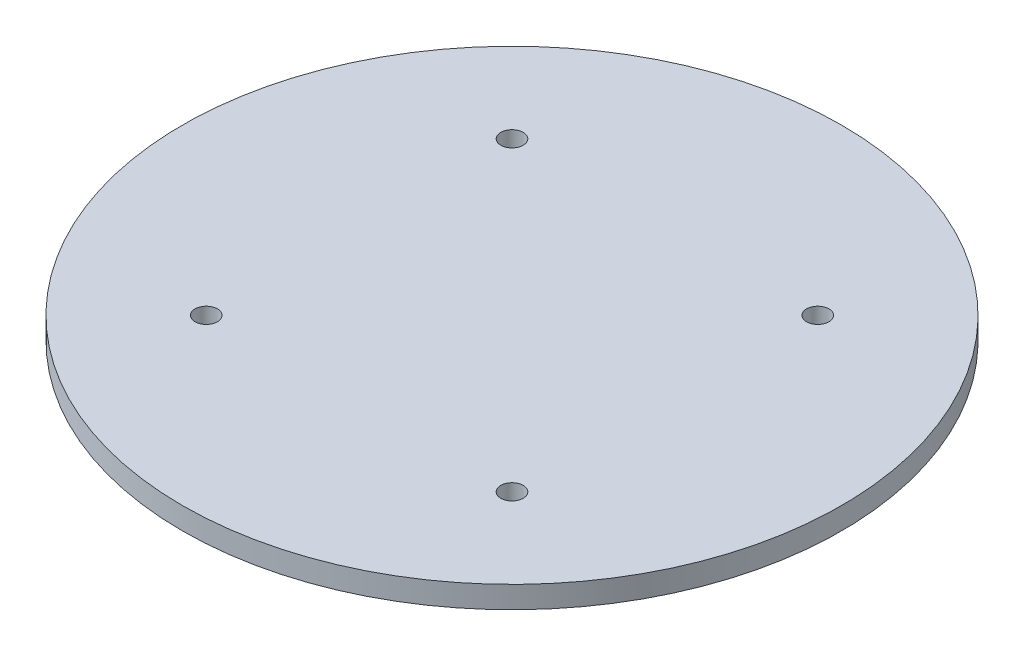
ISO-10303-21;
HEADER;
FILE_DESCRIPTION(('STEP AP214'),'2;1');
FILE_NAME('part.step','',(''),(''),'','','');
FILE_SCHEMA(('AUTOMOTIVE_DESIGN { 1 0 10303 214 1 1 1 1 }'));
ENDSEC;
DATA;
#1=APPLICATION_CONTEXT('core data for automotive mechanical design processes');
#2=APPLICATION_PROTOCOL_DEFINITION('international standard','automotive_design',2000,#1);
#3=PRODUCT_CONTEXT('',#1,'mechanical');
#4=PRODUCT('Part','Part','',(#3));
#5=PRODUCT_RELATED_PRODUCT_CATEGORY('part','',(#4));
#6=PRODUCT_DEFINITION_FORMATION('','',#4);
#7=PRODUCT_DEFINITION_CONTEXT('part definition',#1,'design');
#8=PRODUCT_DEFINITION('design','',#6,#7);
#9=PRODUCT_DEFINITION_SHAPE('','',#8);
#10=(LENGTH_UNIT() NAMED_UNIT(*) SI_UNIT(.MILLI.,.METRE.));
#11=(NAMED_UNIT(*) PLANE_ANGLE_UNIT() SI_UNIT($,.RADIAN.));
#12=(NAMED_UNIT(*) SI_UNIT($,.STERADIAN.) SOLID_ANGLE_UNIT());
#13=UNCERTAINTY_MEASURE_WITH_UNIT(LENGTH_MEASURE(1.E-05),#10,'distance_accuracy_value','');
#14=(GEOMETRIC_REPRESENTATION_CONTEXT(3) GLOBAL_UNCERTAINTY_ASSIGNED_CONTEXT((#13)) GLOBAL_UNIT_ASSIGNED_CONTEXT((#10,
#11,#12)) REPRESENTATION_CONTEXT('',''));
#15=CARTESIAN_POINT('',(0.,0.,0.));
#16=DIRECTION('',(0.,0.,1.));
#17=DIRECTION('',(1.,0.,0.));
#18=AXIS2_PLACEMENT_3D('',#15,#16,#17);
#19=CARTESIAN_POINT('',(0.,0.,0.));
#20=DIRECTION('',(0.,1.,0.));
#21=DIRECTION('',(0.,0.,1.));
#22=AXIS2_PLACEMENT_3D('',#19,#20,#21);
#23=PLANE('',#22);
#24=CARTESIAN_POINT('',(0.,0.,0.));
#25=DIRECTION('',(0.,1.,0.));
#26=DIRECTION('',(0.,0.,1.));
#27=AXIS2_PLACEMENT_3D('',#24,#25,#26);
#28=CIRCLE('',#27,75.);
#29=CARTESIAN_POINT('',(0.,0.,75.));
#30=VERTEX_POINT('',#29);
#31=EDGE_CURVE('E41',#30,#30,#28,.T.);
#32=ORIENTED_EDGE('',*,*,#31,.F.);
#33=EDGE_LOOP('',(#32));
#34=FACE_BOUND('',#33,.T.);
#35=CARTESIAN_POINT('',(34.79,0.,-34.79));
#36=DIRECTION('',(0.,-1.,0.));
#37=DIRECTION('',(0.,0.,-1.));
#38=AXIS2_PLACEMENT_3D('',#35,#36,#37);
#39=CIRCLE('',#38,2.55000000000001);
#40=CARTESIAN_POINT('',(34.79,0.,-37.34));
#41=VERTEX_POINT('',#40);
#42=EDGE_CURVE('E52',#41,#41,#39,.T.);
#43=ORIENTED_EDGE('',*,*,#42,.F.);
#44=EDGE_LOOP('',(#43));
#45=FACE_BOUND('',#44,.T.);
#46=CARTESIAN_POINT('',(-34.79,0.,34.79));
#47=DIRECTION('',(0.,-1.,0.));
#48=DIRECTION('',(0.,0.,-1.));
#49=AXIS2_PLACEMENT_3D('',#46,#47,#48);
#50=CIRCLE('',#49,2.55000000000001);
#51=CARTESIAN_POINT('',(-34.79,0.,32.24));
#52=VERTEX_POINT('',#51);
#53=EDGE_CURVE('E58',#52,#52,#50,.T.);
#54=ORIENTED_EDGE('',*,*,#53,.F.);
#55=EDGE_LOOP('',(#54));
#56=FACE_BOUND('',#55,.T.);
#57=CARTESIAN_POINT('',(-34.79,0.,-34.79));
#58=DIRECTION('',(0.,-1.,0.));
#59=DIRECTION('',(0.,0.,-1.));
#60=AXIS2_PLACEMENT_3D('',#57,#58,#59);
#61=CIRCLE('',#60,2.55000000000001);
#62=CARTESIAN_POINT('',(-34.79,0.,-37.34));
#63=VERTEX_POINT('',#62);
#64=EDGE_CURVE('E64',#63,#63,#61,.T.);
#65=ORIENTED_EDGE('',*,*,#64,.F.);
#66=EDGE_LOOP('',(#65));
#67=FACE_BOUND('',#66,.T.);
#68=CARTESIAN_POINT('',(34.79,0.,34.79));
#69=DIRECTION('',(0.,-1.,0.));
#70=DIRECTION('',(0.,0.,-1.));
#71=AXIS2_PLACEMENT_3D('',#68,#69,#70);
#72=CIRCLE('',#71,2.55000000000001);
#73=CARTESIAN_POINT('',(34.79,0.,32.24));
#74=VERTEX_POINT('',#73);
#75=EDGE_CURVE('E70',#74,#74,#72,.T.);
#76=ORIENTED_EDGE('',*,*,#75,.F.);
#77=EDGE_LOOP('',(#76));
#78=FACE_BOUND('',#77,.T.);
#79=ADVANCED_FACE('F37',(#34,#45,#56,#67,#78),#23,.F.);
#80=CARTESIAN_POINT('',(0.,5.,0.));
#81=DIRECTION('',(0.,-1.,0.));
#82=DIRECTION('',(0.,0.,-1.));
#83=AXIS2_PLACEMENT_3D('',#80,#81,#82);
#84=CYLINDRICAL_SURFACE('',#83,75.);
#85=CARTESIAN_POINT('',(0.,5.,0.));
#86=DIRECTION('',(0.,1.,0.));
#87=DIRECTION('',(0.,0.,1.));
#88=AXIS2_PLACEMENT_3D('',#85,#86,#87);
#89=CIRCLE('',#88,75.);
#90=CARTESIAN_POINT('',(0.,5.,75.));
#91=VERTEX_POINT('',#90);
#92=EDGE_CURVE('E10',#91,#91,#89,.T.);
#93=ORIENTED_EDGE('',*,*,#92,.F.);
#94=EDGE_LOOP('',(#93));
#95=FACE_BOUND('',#94,.T.);
#96=ORIENTED_EDGE('',*,*,#31,.T.);
#97=EDGE_LOOP('',(#96));
#98=FACE_BOUND('',#97,.T.);
#99=ADVANCED_FACE('F39',(#95,#98),#84,.T.);
#100=CARTESIAN_POINT('',(0.,5.,0.));
#101=DIRECTION('',(0.,1.,0.));
#102=DIRECTION('',(0.,0.,1.));
#103=AXIS2_PLACEMENT_3D('',#100,#101,#102);
#104=PLANE('',#103);
#105=CARTESIAN_POINT('',(34.79,5.,34.79));
#106=DIRECTION('',(0.,1.,0.));
#107=DIRECTION('',(0.,0.,1.));
#108=AXIS2_PLACEMENT_3D('',#105,#106,#107);
#109=CIRCLE('',#108,2.55000000000001);
#110=CARTESIAN_POINT('',(34.79,5.,37.34));
#111=VERTEX_POINT('',#110);
#112=EDGE_CURVE('E67',#111,#111,#109,.T.);
#113=ORIENTED_EDGE('',*,*,#112,.F.);
#114=EDGE_LOOP('',(#113));
#115=FACE_BOUND('',#114,.T.);
#116=CARTESIAN_POINT('',(-34.79,5.,-34.79));
#117=DIRECTION('',(0.,1.,0.));
#118=DIRECTION('',(0.,0.,1.));
#119=AXIS2_PLACEMENT_3D('',#116,#117,#118);
#120=CIRCLE('',#119,2.55000000000001);
#121=CARTESIAN_POINT('',(-34.79,5.,-32.24));
#122=VERTEX_POINT('',#121);
#123=EDGE_CURVE('E61',#122,#122,#120,.T.);
#124=ORIENTED_EDGE('',*,*,#123,.F.);
#125=EDGE_LOOP('',(#124));
#126=FACE_BOUND('',#125,.T.);
#127=CARTESIAN_POINT('',(-34.79,5.,34.79));
#128=DIRECTION('',(0.,1.,0.));
#129=DIRECTION('',(0.,0.,1.));
#130=AXIS2_PLACEMENT_3D('',#127,#128,#129);
#131=CIRCLE('',#130,2.55000000000001);
#132=CARTESIAN_POINT('',(-34.79,5.,37.34));
#133=VERTEX_POINT('',#132);
#134=EDGE_CURVE('E55',#133,#133,#131,.T.);
#135=ORIENTED_EDGE('',*,*,#134,.F.);
#136=EDGE_LOOP('',(#135));
#137=FACE_BOUND('',#136,.T.);
#138=CARTESIAN_POINT('',(34.79,5.,-34.79));
#139=DIRECTION('',(0.,1.,0.));
#140=DIRECTION('',(0.,0.,1.));
#141=AXIS2_PLACEMENT_3D('',#138,#139,#140);
#142=CIRCLE('',#141,2.55000000000001);
#143=CARTESIAN_POINT('',(34.79,5.,-32.24));
#144=VERTEX_POINT('',#143);
#145=EDGE_CURVE('E48',#144,#144,#142,.T.);
#146=ORIENTED_EDGE('',*,*,#145,.F.);
#147=EDGE_LOOP('',(#146));
#148=FACE_BOUND('',#147,.T.);
#149=ORIENTED_EDGE('',*,*,#92,.T.);
#150=EDGE_LOOP('',(#149));
#151=FACE_BOUND('',#150,.T.);
#152=ADVANCED_FACE('F83',(#115,#126,#137,#148,#151),#104,.T.);
#153=CARTESIAN_POINT('',(34.79,0.,-34.79));
#154=DIRECTION('',(0.,-1.,0.));
#155=DIRECTION('',(0.,0.,-1.));
#156=AXIS2_PLACEMENT_3D('',#153,#154,#155);
#157=CYLINDRICAL_SURFACE('',#156,2.55000000000001);
#158=ORIENTED_EDGE('',*,*,#42,.T.);
#159=EDGE_LOOP('',(#158));
#160=FACE_BOUND('',#159,.T.);
#161=ORIENTED_EDGE('',*,*,#145,.T.);
#162=EDGE_LOOP('',(#161));
#163=FACE_BOUND('',#162,.T.);
#164=ADVANCED_FACE('F89',(#160,#163),#157,.F.);
#165=CARTESIAN_POINT('',(-34.79,0.,34.79));
#166=DIRECTION('',(0.,-1.,0.));
#167=DIRECTION('',(0.,0.,-1.));
#168=AXIS2_PLACEMENT_3D('',#165,#166,#167);
#169=CYLINDRICAL_SURFACE('',#168,2.55000000000001);
#170=ORIENTED_EDGE('',*,*,#53,.T.);
#171=EDGE_LOOP('',(#170));
#172=FACE_BOUND('',#171,.T.);
#173=ORIENTED_EDGE('',*,*,#134,.T.);
#174=EDGE_LOOP('',(#173));
#175=FACE_BOUND('',#174,.T.);
#176=ADVANCED_FACE('F93',(#172,#175),#169,.F.);
#177=CARTESIAN_POINT('',(-34.79,0.,-34.79));
#178=DIRECTION('',(0.,-1.,0.));
#179=DIRECTION('',(0.,0.,-1.));
#180=AXIS2_PLACEMENT_3D('',#177,#178,#179);
#181=CYLINDRICAL_SURFACE('',#180,2.55000000000001);
#182=ORIENTED_EDGE('',*,*,#64,.T.);
#183=EDGE_LOOP('',(#182));
#184=FACE_BOUND('',#183,.T.);
#185=ORIENTED_EDGE('',*,*,#123,.T.);
#186=EDGE_LOOP('',(#185));
#187=FACE_BOUND('',#186,.T.);
#188=ADVANCED_FACE('F97',(#184,#187),#181,.F.);
#189=CARTESIAN_POINT('',(34.79,0.,34.79));
#190=DIRECTION('',(0.,-1.,0.));
#191=DIRECTION('',(0.,0.,-1.));
#192=AXIS2_PLACEMENT_3D('',#189,#190,#191);
#193=CYLINDRICAL_SURFACE('',#192,2.55000000000001);
#194=ORIENTED_EDGE('',*,*,#75,.T.);
#195=EDGE_LOOP('',(#194));
#196=FACE_BOUND('',#195,.T.);
#197=ORIENTED_EDGE('',*,*,#112,.T.);
#198=EDGE_LOOP('',(#197));
#199=FACE_BOUND('',#198,.T.);
#200=ADVANCED_FACE('F74',(#196,#199),#193,.F.);
#201=CLOSED_SHELL('',(#79,#99,#152,#164,#176,#188,#200));
#202=MANIFOLD_SOLID_BREP('B2',#201);
#203=ADVANCED_BREP_SHAPE_REPRESENTATION('',(#18,#202),#14);
#204=SHAPE_DEFINITION_REPRESENTATION(#9,#203);
ENDSEC;
END-ISO-10303-21;
